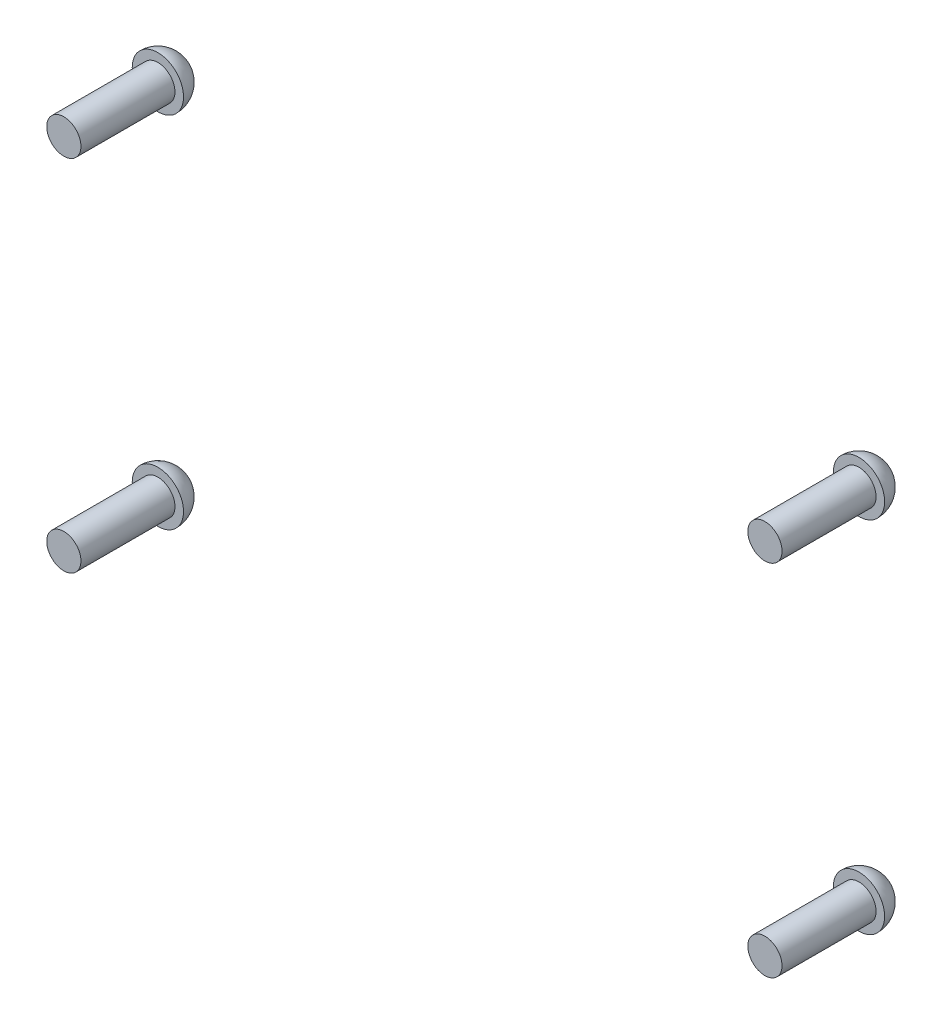
ISO-10303-21;
HEADER;
FILE_DESCRIPTION(('STEP AP214'),'2;1');
FILE_NAME('part.step','',(''),(''),'','','');
FILE_SCHEMA(('AUTOMOTIVE_DESIGN { 1 0 10303 214 1 1 1 1 }'));
ENDSEC;
DATA;
#1=APPLICATION_CONTEXT('core data for automotive mechanical design processes');
#2=APPLICATION_PROTOCOL_DEFINITION('international standard','automotive_design',2000,#1);
#3=PRODUCT_CONTEXT('',#1,'mechanical');
#4=PRODUCT('Part','Part','',(#3));
#5=PRODUCT_RELATED_PRODUCT_CATEGORY('part','',(#4));
#6=PRODUCT_DEFINITION_FORMATION('','',#4);
#7=PRODUCT_DEFINITION_CONTEXT('part definition',#1,'design');
#8=PRODUCT_DEFINITION('design','',#6,#7);
#9=PRODUCT_DEFINITION_SHAPE('','',#8);
#10=(LENGTH_UNIT() NAMED_UNIT(*) SI_UNIT(.MILLI.,.METRE.));
#11=(NAMED_UNIT(*) PLANE_ANGLE_UNIT() SI_UNIT($,.RADIAN.));
#12=(NAMED_UNIT(*) SI_UNIT($,.STERADIAN.) SOLID_ANGLE_UNIT());
#13=UNCERTAINTY_MEASURE_WITH_UNIT(LENGTH_MEASURE(1.E-05),#10,'distance_accuracy_value','');
#14=(GEOMETRIC_REPRESENTATION_CONTEXT(3) GLOBAL_UNCERTAINTY_ASSIGNED_CONTEXT((#13)) GLOBAL_UNIT_ASSIGNED_CONTEXT((#10,
#11,#12)) REPRESENTATION_CONTEXT('',''));
#15=CARTESIAN_POINT('',(0.,0.,0.));
#16=DIRECTION('',(0.,0.,1.));
#17=DIRECTION('',(1.,0.,0.));
#18=AXIS2_PLACEMENT_3D('',#15,#16,#17);
#19=CARTESIAN_POINT('',(364.631346367523,-176.280061995667,-0.00999999999999959));
#20=DIRECTION('',(0.,0.,-1.));
#21=DIRECTION('',(-1.,0.,0.));
#22=AXIS2_PLACEMENT_3D('',#19,#20,#21);
#23=DEGENERATE_TOROIDAL_SURFACE('',#22,0.00999999999996663,14.99,.T.);
#24=CARTESIAN_POINT('',(364.631346367523,-176.280061995667,-15.));
#25=DIRECTION('',(0.,0.,-1.));
#26=DIRECTION('',(-1.,0.,0.));
#27=AXIS2_PLACEMENT_3D('',#24,#25,#26);
#28=CIRCLE('',#27,0.00999999999996663);
#29=CARTESIAN_POINT('',(364.621346367523,-176.280061995667,-15.));
#30=VERTEX_POINT('',#29);
#31=EDGE_CURVE('E56',#30,#30,#28,.T.);
#32=ORIENTED_EDGE('',*,*,#31,.F.);
#33=EDGE_LOOP('',(#32));
#34=FACE_BOUND('',#33,.T.);
#35=CARTESIAN_POINT('',(364.631346367523,-176.280061995667,-0.00999999999999959));
#36=DIRECTION('',(0.,0.,-1.));
#37=DIRECTION('',(-1.,0.,0.));
#38=AXIS2_PLACEMENT_3D('',#35,#36,#37);
#39=CIRCLE('',#38,15.);
#40=CARTESIAN_POINT('',(349.631346367523,-176.280061995667,-0.00999999999999959));
#41=VERTEX_POINT('',#40);
#42=EDGE_CURVE('E11',#41,#41,#39,.F.);
#43=ORIENTED_EDGE('',*,*,#42,.F.);
#44=EDGE_LOOP('',(#43));
#45=FACE_BOUND('',#44,.T.);
#46=ADVANCED_FACE('F50',(#34,#45),#23,.T.);
#47=CARTESIAN_POINT('',(364.631346367523,-176.280061995667,55.));
#48=DIRECTION('',(0.,0.,-1.));
#49=DIRECTION('',(-1.,0.,0.));
#50=AXIS2_PLACEMENT_3D('',#47,#48,#49);
#51=CYLINDRICAL_SURFACE('',#50,9.99999999999998);
#52=CARTESIAN_POINT('',(364.631346367523,-176.280061995667,55.));
#53=DIRECTION('',(0.,0.,1.));
#54=DIRECTION('',(1.,0.,0.));
#55=AXIS2_PLACEMENT_3D('',#52,#53,#54);
#56=CIRCLE('',#55,9.99999999999998);
#57=CARTESIAN_POINT('',(374.631346367523,-176.280061995667,55.));
#58=VERTEX_POINT('',#57);
#59=EDGE_CURVE('E60',#58,#58,#56,.T.);
#60=ORIENTED_EDGE('',*,*,#59,.F.);
#61=EDGE_LOOP('',(#60));
#62=FACE_BOUND('',#61,.T.);
#63=CARTESIAN_POINT('',(364.631346367523,-176.280061995667,0.));
#64=DIRECTION('',(0.,0.,1.));
#65=DIRECTION('',(1.,0.,0.));
#66=AXIS2_PLACEMENT_3D('',#63,#64,#65);
#67=CIRCLE('',#66,9.99999999999998);
#68=CARTESIAN_POINT('',(374.631346367523,-176.280061995667,0.));
#69=VERTEX_POINT('',#68);
#70=EDGE_CURVE('E64',#69,#69,#67,.T.);
#71=ORIENTED_EDGE('',*,*,#70,.T.);
#72=EDGE_LOOP('',(#71));
#73=FACE_BOUND('',#72,.T.);
#74=ADVANCED_FACE('F87',(#62,#73),#51,.T.);
#75=CARTESIAN_POINT('',(364.631346367523,-176.280061995667,55.));
#76=DIRECTION('',(0.,0.,1.));
#77=DIRECTION('',(1.,0.,0.));
#78=AXIS2_PLACEMENT_3D('',#75,#76,#77);
#79=PLANE('',#78);
#80=ORIENTED_EDGE('',*,*,#59,.T.);
#81=EDGE_LOOP('',(#80));
#82=FACE_BOUND('',#81,.T.);
#83=ADVANCED_FACE('F92',(#82),#79,.T.);
#84=CARTESIAN_POINT('',(364.631346367523,-176.280061995667,-15.));
#85=DIRECTION('',(0.,0.,1.));
#86=DIRECTION('',(1.,0.,0.));
#87=AXIS2_PLACEMENT_3D('',#84,#85,#86);
#88=CYLINDRICAL_SURFACE('',#87,15.);
#89=ORIENTED_EDGE('',*,*,#42,.T.);
#90=EDGE_LOOP('',(#89));
#91=FACE_BOUND('',#90,.T.);
#92=CARTESIAN_POINT('',(364.631346367523,-176.280061995667,0.));
#93=DIRECTION('',(0.,0.,-1.));
#94=DIRECTION('',(-1.,0.,0.));
#95=AXIS2_PLACEMENT_3D('',#92,#93,#94);
#96=CIRCLE('',#95,15.);
#97=CARTESIAN_POINT('',(349.631346367523,-176.280061995667,0.));
#98=VERTEX_POINT('',#97);
#99=EDGE_CURVE('E69',#98,#98,#96,.T.);
#100=ORIENTED_EDGE('',*,*,#99,.T.);
#101=EDGE_LOOP('',(#100));
#102=FACE_BOUND('',#101,.T.);
#103=ADVANCED_FACE('F73',(#91,#102),#88,.T.);
#104=CARTESIAN_POINT('',(364.631346367523,-176.280061995667,-15.));
#105=DIRECTION('',(0.,0.,-1.));
#106=DIRECTION('',(-1.,0.,0.));
#107=AXIS2_PLACEMENT_3D('',#104,#105,#106);
#108=PLANE('',#107);
#109=ORIENTED_EDGE('',*,*,#31,.T.);
#110=EDGE_LOOP('',(#109));
#111=FACE_BOUND('',#110,.T.);
#112=ADVANCED_FACE('F77',(#111),#108,.T.);
#113=CARTESIAN_POINT('',(364.631346367523,-176.280061995667,0.));
#114=DIRECTION('',(0.,0.,-1.));
#115=DIRECTION('',(-1.,0.,0.));
#116=AXIS2_PLACEMENT_3D('',#113,#114,#115);
#117=PLANE('',#116);
#118=ORIENTED_EDGE('',*,*,#70,.F.);
#119=EDGE_LOOP('',(#118));
#120=FACE_BOUND('',#119,.T.);
#121=ORIENTED_EDGE('',*,*,#99,.F.);
#122=EDGE_LOOP('',(#121));
#123=FACE_BOUND('',#122,.T.);
#124=ADVANCED_FACE('F75',(#120,#123),#117,.F.);
#125=CLOSED_SHELL('',(#46,#74,#83,#103,#112,#124));
#126=MANIFOLD_SOLID_BREP('B2',#125);
#127=CARTESIAN_POINT('',(364.631346367523,33.719938004333,-0.00999999999999959));
#128=DIRECTION('',(0.,0.,-1.));
#129=DIRECTION('',(-1.,0.,0.));
#130=AXIS2_PLACEMENT_3D('',#127,#128,#129);
#131=DEGENERATE_TOROIDAL_SURFACE('',#130,0.00999999999996663,14.99,.T.);
#132=CARTESIAN_POINT('',(364.631346367523,33.719938004333,-15.));
#133=DIRECTION('',(0.,0.,-1.));
#134=DIRECTION('',(-1.,0.,0.));
#135=AXIS2_PLACEMENT_3D('',#132,#133,#134);
#136=CIRCLE('',#135,0.00999999999996663);
#137=CARTESIAN_POINT('',(364.621346367523,33.719938004333,-15.));
#138=VERTEX_POINT('',#137);
#139=EDGE_CURVE('E162',#138,#138,#136,.T.);
#140=ORIENTED_EDGE('',*,*,#139,.F.);
#141=EDGE_LOOP('',(#140));
#142=FACE_BOUND('',#141,.T.);
#143=CARTESIAN_POINT('',(364.631346367523,33.719938004333,-0.00999999999999959));
#144=DIRECTION('',(0.,0.,-1.));
#145=DIRECTION('',(-1.,0.,0.));
#146=AXIS2_PLACEMENT_3D('',#143,#144,#145);
#147=CIRCLE('',#146,15.);
#148=CARTESIAN_POINT('',(349.631346367523,33.719938004333,-0.00999999999999959));
#149=VERTEX_POINT('',#148);
#150=EDGE_CURVE('E49',#149,#149,#147,.F.);
#151=ORIENTED_EDGE('',*,*,#150,.F.);
#152=EDGE_LOOP('',(#151));
#153=FACE_BOUND('',#152,.T.);
#154=ADVANCED_FACE('F156',(#142,#153),#131,.T.);
#155=CARTESIAN_POINT('',(364.631346367523,33.719938004333,55.));
#156=DIRECTION('',(0.,0.,-1.));
#157=DIRECTION('',(-1.,0.,0.));
#158=AXIS2_PLACEMENT_3D('',#155,#156,#157);
#159=CYLINDRICAL_SURFACE('',#158,9.99999999999998);
#160=CARTESIAN_POINT('',(364.631346367523,33.719938004333,55.));
#161=DIRECTION('',(0.,0.,1.));
#162=DIRECTION('',(1.,0.,0.));
#163=AXIS2_PLACEMENT_3D('',#160,#161,#162);
#164=CIRCLE('',#163,9.99999999999998);
#165=CARTESIAN_POINT('',(374.631346367523,33.719938004333,55.));
#166=VERTEX_POINT('',#165);
#167=EDGE_CURVE('E166',#166,#166,#164,.T.);
#168=ORIENTED_EDGE('',*,*,#167,.F.);
#169=EDGE_LOOP('',(#168));
#170=FACE_BOUND('',#169,.T.);
#171=CARTESIAN_POINT('',(364.631346367523,33.719938004333,0.));
#172=DIRECTION('',(0.,0.,1.));
#173=DIRECTION('',(1.,0.,0.));
#174=AXIS2_PLACEMENT_3D('',#171,#172,#173);
#175=CIRCLE('',#174,9.99999999999998);
#176=CARTESIAN_POINT('',(374.631346367523,33.719938004333,0.));
#177=VERTEX_POINT('',#176);
#178=EDGE_CURVE('E170',#177,#177,#175,.T.);
#179=ORIENTED_EDGE('',*,*,#178,.T.);
#180=EDGE_LOOP('',(#179));
#181=FACE_BOUND('',#180,.T.);
#182=ADVANCED_FACE('F193',(#170,#181),#159,.T.);
#183=CARTESIAN_POINT('',(364.631346367523,33.719938004333,55.));
#184=DIRECTION('',(0.,0.,1.));
#185=DIRECTION('',(1.,0.,0.));
#186=AXIS2_PLACEMENT_3D('',#183,#184,#185);
#187=PLANE('',#186);
#188=ORIENTED_EDGE('',*,*,#167,.T.);
#189=EDGE_LOOP('',(#188));
#190=FACE_BOUND('',#189,.T.);
#191=ADVANCED_FACE('F198',(#190),#187,.T.);
#192=CARTESIAN_POINT('',(364.631346367523,33.719938004333,-15.));
#193=DIRECTION('',(0.,0.,1.));
#194=DIRECTION('',(1.,0.,0.));
#195=AXIS2_PLACEMENT_3D('',#192,#193,#194);
#196=CYLINDRICAL_SURFACE('',#195,15.);
#197=ORIENTED_EDGE('',*,*,#150,.T.);
#198=EDGE_LOOP('',(#197));
#199=FACE_BOUND('',#198,.T.);
#200=CARTESIAN_POINT('',(364.631346367523,33.719938004333,0.));
#201=DIRECTION('',(0.,0.,-1.));
#202=DIRECTION('',(-1.,0.,0.));
#203=AXIS2_PLACEMENT_3D('',#200,#201,#202);
#204=CIRCLE('',#203,15.);
#205=CARTESIAN_POINT('',(349.631346367523,33.719938004333,0.));
#206=VERTEX_POINT('',#205);
#207=EDGE_CURVE('E175',#206,#206,#204,.T.);
#208=ORIENTED_EDGE('',*,*,#207,.T.);
#209=EDGE_LOOP('',(#208));
#210=FACE_BOUND('',#209,.T.);
#211=ADVANCED_FACE('F179',(#199,#210),#196,.T.);
#212=CARTESIAN_POINT('',(364.631346367523,33.719938004333,-15.));
#213=DIRECTION('',(0.,0.,-1.));
#214=DIRECTION('',(-1.,0.,0.));
#215=AXIS2_PLACEMENT_3D('',#212,#213,#214);
#216=PLANE('',#215);
#217=ORIENTED_EDGE('',*,*,#139,.T.);
#218=EDGE_LOOP('',(#217));
#219=FACE_BOUND('',#218,.T.);
#220=ADVANCED_FACE('F183',(#219),#216,.T.);
#221=CARTESIAN_POINT('',(364.631346367523,33.719938004333,0.));
#222=DIRECTION('',(0.,0.,-1.));
#223=DIRECTION('',(-1.,0.,0.));
#224=AXIS2_PLACEMENT_3D('',#221,#222,#223);
#225=PLANE('',#224);
#226=ORIENTED_EDGE('',*,*,#178,.F.);
#227=EDGE_LOOP('',(#226));
#228=FACE_BOUND('',#227,.T.);
#229=ORIENTED_EDGE('',*,*,#207,.F.);
#230=EDGE_LOOP('',(#229));
#231=FACE_BOUND('',#230,.T.);
#232=ADVANCED_FACE('F181',(#228,#231),#225,.F.);
#233=CLOSED_SHELL('',(#154,#182,#191,#211,#220,#232));
#234=MANIFOLD_SOLID_BREP('B6',#233);
#235=CARTESIAN_POINT('',(-45.3686536324769,33.719938004333,-0.00999999999999959));
#236=DIRECTION('',(0.,0.,-1.));
#237=DIRECTION('',(-1.,0.,0.));
#238=AXIS2_PLACEMENT_3D('',#235,#236,#237);
#239=DEGENERATE_TOROIDAL_SURFACE('',#238,0.00999999999999786,14.99,.T.);
#240=CARTESIAN_POINT('',(-45.3686536324769,33.719938004333,-15.));
#241=DIRECTION('',(0.,0.,-1.));
#242=DIRECTION('',(-1.,0.,0.));
#243=AXIS2_PLACEMENT_3D('',#240,#241,#242);
#244=CIRCLE('',#243,0.00999999999999786);
#245=CARTESIAN_POINT('',(-45.3786536324769,33.719938004333,-15.));
#246=VERTEX_POINT('',#245);
#247=EDGE_CURVE('E267',#246,#246,#244,.T.);
#248=ORIENTED_EDGE('',*,*,#247,.F.);
#249=EDGE_LOOP('',(#248));
#250=FACE_BOUND('',#249,.T.);
#251=CARTESIAN_POINT('',(-45.3686536324769,33.719938004333,-0.00999999999999959));
#252=DIRECTION('',(0.,0.,-1.));
#253=DIRECTION('',(-1.,0.,0.));
#254=AXIS2_PLACEMENT_3D('',#251,#252,#253);
#255=CIRCLE('',#254,15.);
#256=CARTESIAN_POINT('',(-60.3686536324769,33.719938004333,-0.00999999999999959));
#257=VERTEX_POINT('',#256);
#258=EDGE_CURVE('E155',#257,#257,#255,.F.);
#259=ORIENTED_EDGE('',*,*,#258,.F.);
#260=EDGE_LOOP('',(#259));
#261=FACE_BOUND('',#260,.T.);
#262=ADVANCED_FACE('F261',(#250,#261),#239,.T.);
#263=CARTESIAN_POINT('',(-45.3686536324769,33.719938004333,55.));
#264=DIRECTION('',(0.,0.,-1.));
#265=DIRECTION('',(-1.,0.,0.));
#266=AXIS2_PLACEMENT_3D('',#263,#264,#265);
#267=CYLINDRICAL_SURFACE('',#266,10.);
#268=CARTESIAN_POINT('',(-45.3686536324769,33.719938004333,55.));
#269=DIRECTION('',(0.,0.,1.));
#270=DIRECTION('',(1.,0.,0.));
#271=AXIS2_PLACEMENT_3D('',#268,#269,#270);
#272=CIRCLE('',#271,10.);
#273=CARTESIAN_POINT('',(-35.3686536324769,33.719938004333,55.));
#274=VERTEX_POINT('',#273);
#275=EDGE_CURVE('E271',#274,#274,#272,.T.);
#276=ORIENTED_EDGE('',*,*,#275,.F.);
#277=EDGE_LOOP('',(#276));
#278=FACE_BOUND('',#277,.T.);
#279=CARTESIAN_POINT('',(-45.3686536324769,33.719938004333,0.));
#280=DIRECTION('',(0.,0.,1.));
#281=DIRECTION('',(1.,0.,0.));
#282=AXIS2_PLACEMENT_3D('',#279,#280,#281);
#283=CIRCLE('',#282,10.);
#284=CARTESIAN_POINT('',(-35.3686536324769,33.719938004333,0.));
#285=VERTEX_POINT('',#284);
#286=EDGE_CURVE('E275',#285,#285,#283,.T.);
#287=ORIENTED_EDGE('',*,*,#286,.T.);
#288=EDGE_LOOP('',(#287));
#289=FACE_BOUND('',#288,.T.);
#290=ADVANCED_FACE('F298',(#278,#289),#267,.T.);
#291=CARTESIAN_POINT('',(-45.3686536324769,33.719938004333,55.));
#292=DIRECTION('',(0.,0.,1.));
#293=DIRECTION('',(1.,0.,0.));
#294=AXIS2_PLACEMENT_3D('',#291,#292,#293);
#295=PLANE('',#294);
#296=ORIENTED_EDGE('',*,*,#275,.T.);
#297=EDGE_LOOP('',(#296));
#298=FACE_BOUND('',#297,.T.);
#299=ADVANCED_FACE('F303',(#298),#295,.T.);
#300=CARTESIAN_POINT('',(-45.3686536324769,33.719938004333,-15.));
#301=DIRECTION('',(0.,0.,1.));
#302=DIRECTION('',(1.,0.,0.));
#303=AXIS2_PLACEMENT_3D('',#300,#301,#302);
#304=CYLINDRICAL_SURFACE('',#303,15.);
#305=ORIENTED_EDGE('',*,*,#258,.T.);
#306=EDGE_LOOP('',(#305));
#307=FACE_BOUND('',#306,.T.);
#308=CARTESIAN_POINT('',(-45.3686536324769,33.719938004333,0.));
#309=DIRECTION('',(0.,0.,-1.));
#310=DIRECTION('',(-1.,0.,0.));
#311=AXIS2_PLACEMENT_3D('',#308,#309,#310);
#312=CIRCLE('',#311,15.);
#313=CARTESIAN_POINT('',(-60.3686536324769,33.719938004333,0.));
#314=VERTEX_POINT('',#313);
#315=EDGE_CURVE('E280',#314,#314,#312,.T.);
#316=ORIENTED_EDGE('',*,*,#315,.T.);
#317=EDGE_LOOP('',(#316));
#318=FACE_BOUND('',#317,.T.);
#319=ADVANCED_FACE('F284',(#307,#318),#304,.T.);
#320=CARTESIAN_POINT('',(-45.3686536324769,33.719938004333,-15.));
#321=DIRECTION('',(0.,0.,-1.));
#322=DIRECTION('',(-1.,0.,0.));
#323=AXIS2_PLACEMENT_3D('',#320,#321,#322);
#324=PLANE('',#323);
#325=ORIENTED_EDGE('',*,*,#247,.T.);
#326=EDGE_LOOP('',(#325));
#327=FACE_BOUND('',#326,.T.);
#328=ADVANCED_FACE('F288',(#327),#324,.T.);
#329=CARTESIAN_POINT('',(-45.3686536324769,33.719938004333,0.));
#330=DIRECTION('',(0.,0.,-1.));
#331=DIRECTION('',(-1.,0.,0.));
#332=AXIS2_PLACEMENT_3D('',#329,#330,#331);
#333=PLANE('',#332);
#334=ORIENTED_EDGE('',*,*,#286,.F.);
#335=EDGE_LOOP('',(#334));
#336=FACE_BOUND('',#335,.T.);
#337=ORIENTED_EDGE('',*,*,#315,.F.);
#338=EDGE_LOOP('',(#337));
#339=FACE_BOUND('',#338,.T.);
#340=ADVANCED_FACE('F286',(#336,#339),#333,.F.);
#341=CLOSED_SHELL('',(#262,#290,#299,#319,#328,#340));
#342=MANIFOLD_SOLID_BREP('B44',#341);
#343=CARTESIAN_POINT('',(-45.3686536324769,-176.280061995667,-0.00999999999999959));
#344=DIRECTION('',(0.,0.,-1.));
#345=DIRECTION('',(-1.,0.,0.));
#346=AXIS2_PLACEMENT_3D('',#343,#344,#345);
#347=DEGENERATE_TOROIDAL_SURFACE('',#346,0.0100000000000013,14.99,.T.);
#348=CARTESIAN_POINT('',(-45.3686536324769,-176.280061995667,-15.));
#349=DIRECTION('',(0.,0.,-1.));
#350=DIRECTION('',(-1.,0.,0.));
#351=AXIS2_PLACEMENT_3D('',#348,#349,#350);
#352=CIRCLE('',#351,0.0100000000000013);
#353=CARTESIAN_POINT('',(-45.3786536324769,-176.280061995667,-15.));
#354=VERTEX_POINT('',#353);
#355=EDGE_CURVE('E366',#354,#354,#352,.T.);
#356=ORIENTED_EDGE('',*,*,#355,.F.);
#357=EDGE_LOOP('',(#356));
#358=FACE_BOUND('',#357,.T.);
#359=CARTESIAN_POINT('',(-45.3686536324769,-176.280061995667,-0.00999999999999959));
#360=DIRECTION('',(0.,0.,-1.));
#361=DIRECTION('',(-1.,0.,0.));
#362=AXIS2_PLACEMENT_3D('',#359,#360,#361);
#363=CIRCLE('',#362,15.);
#364=CARTESIAN_POINT('',(-60.3686536324769,-176.280061995667,-0.00999999999999959));
#365=VERTEX_POINT('',#364);
#366=EDGE_CURVE('E260',#365,#365,#363,.F.);
#367=ORIENTED_EDGE('',*,*,#366,.F.);
#368=EDGE_LOOP('',(#367));
#369=FACE_BOUND('',#368,.T.);
#370=ADVANCED_FACE('F359',(#358,#369),#347,.T.);
#371=CARTESIAN_POINT('',(-45.3686536324769,-176.280061995667,55.));
#372=DIRECTION('',(0.,0.,-1.));
#373=DIRECTION('',(-1.,0.,0.));
#374=AXIS2_PLACEMENT_3D('',#371,#372,#373);
#375=CYLINDRICAL_SURFACE('',#374,10.);
#376=CARTESIAN_POINT('',(-45.3686536324769,-176.280061995667,55.));
#377=DIRECTION('',(0.,0.,1.));
#378=DIRECTION('',(1.,0.,0.));
#379=AXIS2_PLACEMENT_3D('',#376,#377,#378);
#380=CIRCLE('',#379,10.);
#381=CARTESIAN_POINT('',(-35.3686536324769,-176.280061995667,55.));
#382=VERTEX_POINT('',#381);
#383=EDGE_CURVE('E371',#382,#382,#380,.T.);
#384=ORIENTED_EDGE('',*,*,#383,.F.);
#385=EDGE_LOOP('',(#384));
#386=FACE_BOUND('',#385,.T.);
#387=CARTESIAN_POINT('',(-45.3686536324769,-176.280061995667,0.));
#388=DIRECTION('',(0.,0.,1.));
#389=DIRECTION('',(1.,0.,0.));
#390=AXIS2_PLACEMENT_3D('',#387,#388,#389);
#391=CIRCLE('',#390,10.);
#392=CARTESIAN_POINT('',(-35.3686536324769,-176.280061995667,0.));
#393=VERTEX_POINT('',#392);
#394=EDGE_CURVE('E376',#393,#393,#391,.T.);
#395=ORIENTED_EDGE('',*,*,#394,.T.);
#396=EDGE_LOOP('',(#395));
#397=FACE_BOUND('',#396,.T.);
#398=ADVANCED_FACE('F401',(#386,#397),#375,.T.);
#399=CARTESIAN_POINT('',(-45.3686536324769,-176.280061995667,55.));
#400=DIRECTION('',(0.,0.,1.));
#401=DIRECTION('',(1.,0.,0.));
#402=AXIS2_PLACEMENT_3D('',#399,#400,#401);
#403=PLANE('',#402);
#404=ORIENTED_EDGE('',*,*,#383,.T.);
#405=EDGE_LOOP('',(#404));
#406=FACE_BOUND('',#405,.T.);
#407=ADVANCED_FACE('F406',(#406),#403,.T.);
#408=CARTESIAN_POINT('',(-45.3686536324769,-176.280061995667,-15.));
#409=DIRECTION('',(0.,0.,1.));
#410=DIRECTION('',(1.,0.,0.));
#411=AXIS2_PLACEMENT_3D('',#408,#409,#410);
#412=CYLINDRICAL_SURFACE('',#411,15.);
#413=ORIENTED_EDGE('',*,*,#366,.T.);
#414=EDGE_LOOP('',(#413));
#415=FACE_BOUND('',#414,.T.);
#416=CARTESIAN_POINT('',(-45.3686536324769,-176.280061995667,0.));
#417=DIRECTION('',(0.,0.,-1.));
#418=DIRECTION('',(-1.,0.,0.));
#419=AXIS2_PLACEMENT_3D('',#416,#417,#418);
#420=CIRCLE('',#419,15.);
#421=CARTESIAN_POINT('',(-60.3686536324769,-176.280061995667,0.));
#422=VERTEX_POINT('',#421);
#423=EDGE_CURVE('E381',#422,#422,#420,.T.);
#424=ORIENTED_EDGE('',*,*,#423,.T.);
#425=EDGE_LOOP('',(#424));
#426=FACE_BOUND('',#425,.T.);
#427=ADVANCED_FACE('F387',(#415,#426),#412,.T.);
#428=CARTESIAN_POINT('',(-45.3686536324769,-176.280061995667,-15.));
#429=DIRECTION('',(0.,0.,-1.));
#430=DIRECTION('',(-1.,0.,0.));
#431=AXIS2_PLACEMENT_3D('',#428,#429,#430);
#432=PLANE('',#431);
#433=ORIENTED_EDGE('',*,*,#355,.T.);
#434=EDGE_LOOP('',(#433));
#435=FACE_BOUND('',#434,.T.);
#436=ADVANCED_FACE('F391',(#435),#432,.T.);
#437=CARTESIAN_POINT('',(-45.3686536324769,-176.280061995667,0.));
#438=DIRECTION('',(0.,0.,-1.));
#439=DIRECTION('',(-1.,0.,0.));
#440=AXIS2_PLACEMENT_3D('',#437,#438,#439);
#441=PLANE('',#440);
#442=ORIENTED_EDGE('',*,*,#394,.F.);
#443=EDGE_LOOP('',(#442));
#444=FACE_BOUND('',#443,.T.);
#445=ORIENTED_EDGE('',*,*,#423,.F.);
#446=EDGE_LOOP('',(#445));
#447=FACE_BOUND('',#446,.T.);
#448=ADVANCED_FACE('F389',(#444,#447),#441,.F.);
#449=CLOSED_SHELL('',(#370,#398,#407,#427,#436,#448));
#450=MANIFOLD_SOLID_BREP('B150',#449);
#451=ADVANCED_BREP_SHAPE_REPRESENTATION('',(#18,#126,#234,#342,#450),#14);
#452=SHAPE_DEFINITION_REPRESENTATION(#9,#451);
ENDSEC;
END-ISO-10303-21;
